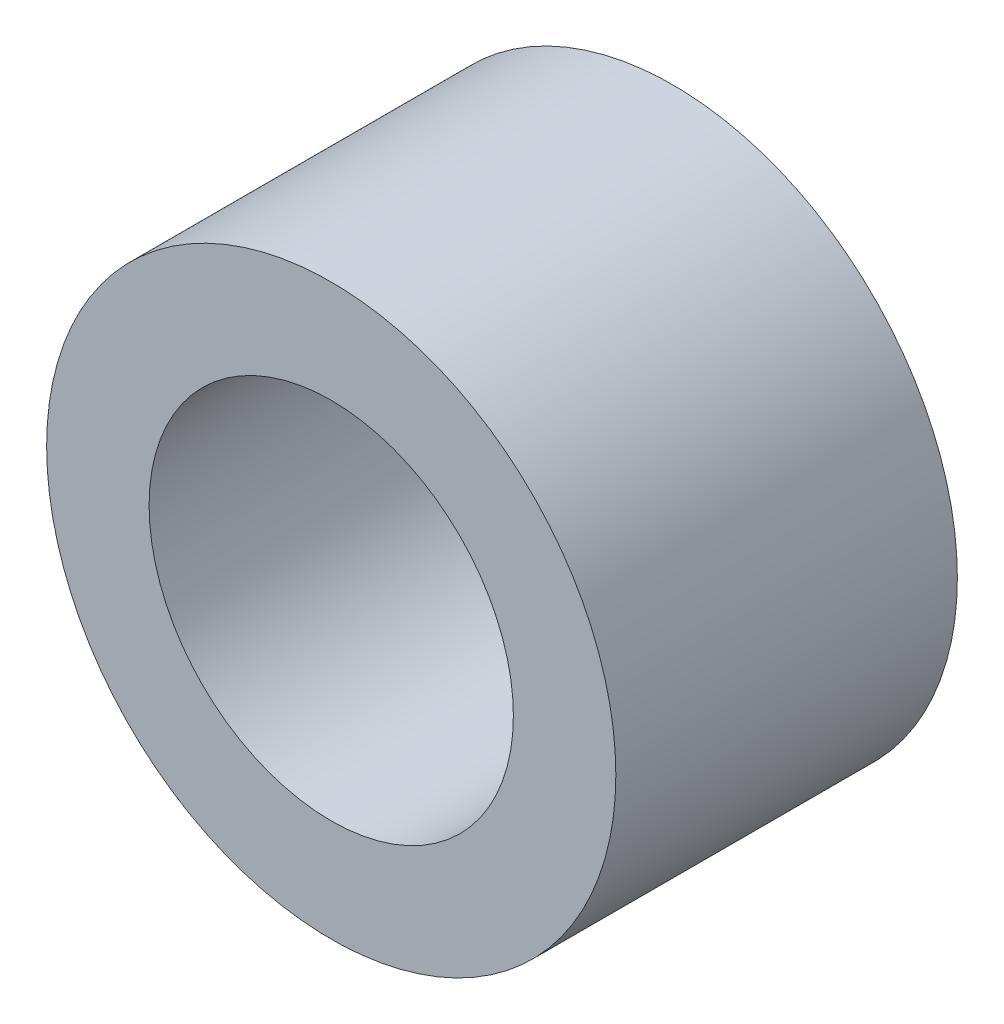
ISO-10303-21;
HEADER;
FILE_DESCRIPTION(('STEP AP214'),'2;1');
FILE_NAME('part.step','',(''),(''),'','','');
FILE_SCHEMA(('AUTOMOTIVE_DESIGN { 1 0 10303 214 1 1 1 1 }'));
ENDSEC;
DATA;
#1=APPLICATION_CONTEXT('core data for automotive mechanical design processes');
#2=APPLICATION_PROTOCOL_DEFINITION('international standard','automotive_design',2000,#1);
#3=PRODUCT_CONTEXT('',#1,'mechanical');
#4=PRODUCT('Part','Part','',(#3));
#5=PRODUCT_RELATED_PRODUCT_CATEGORY('part','',(#4));
#6=PRODUCT_DEFINITION_FORMATION('','',#4);
#7=PRODUCT_DEFINITION_CONTEXT('part definition',#1,'design');
#8=PRODUCT_DEFINITION('design','',#6,#7);
#9=PRODUCT_DEFINITION_SHAPE('','',#8);
#10=(LENGTH_UNIT() NAMED_UNIT(*) SI_UNIT(.MILLI.,.METRE.));
#11=(NAMED_UNIT(*) PLANE_ANGLE_UNIT() SI_UNIT($,.RADIAN.));
#12=(NAMED_UNIT(*) SI_UNIT($,.STERADIAN.) SOLID_ANGLE_UNIT());
#13=UNCERTAINTY_MEASURE_WITH_UNIT(LENGTH_MEASURE(1.E-05),#10,'distance_accuracy_value','');
#14=(GEOMETRIC_REPRESENTATION_CONTEXT(3) GLOBAL_UNCERTAINTY_ASSIGNED_CONTEXT((#13)) GLOBAL_UNIT_ASSIGNED_CONTEXT((#10,
#11,#12)) REPRESENTATION_CONTEXT('',''));
#15=CARTESIAN_POINT('',(0.,0.,0.));
#16=DIRECTION('',(0.,0.,1.));
#17=DIRECTION('',(1.,0.,0.));
#18=AXIS2_PLACEMENT_3D('',#15,#16,#17);
#19=CARTESIAN_POINT('',(0.,0.,3.));
#20=DIRECTION('',(0.,0.,1.));
#21=DIRECTION('',(1.,0.,0.));
#22=AXIS2_PLACEMENT_3D('',#19,#20,#21);
#23=PLANE('',#22);
#24=CARTESIAN_POINT('',(0.,0.,3.));
#25=DIRECTION('',(0.,0.,1.));
#26=DIRECTION('',(1.,0.,0.));
#27=AXIS2_PLACEMENT_3D('',#24,#25,#26);
#28=CIRCLE('',#27,2.5);
#29=CARTESIAN_POINT('',(2.5,0.,3.));
#30=VERTEX_POINT('',#29);
#31=EDGE_CURVE('E10',#30,#30,#28,.T.);
#32=ORIENTED_EDGE('',*,*,#31,.T.);
#33=EDGE_LOOP('',(#32));
#34=FACE_BOUND('',#33,.T.);
#35=CARTESIAN_POINT('',(0.,0.,3.));
#36=DIRECTION('',(0.,0.,1.));
#37=DIRECTION('',(1.,0.,0.));
#38=AXIS2_PLACEMENT_3D('',#35,#36,#37);
#39=CIRCLE('',#38,1.6);
#40=CARTESIAN_POINT('',(1.6,0.,3.));
#41=VERTEX_POINT('',#40);
#42=EDGE_CURVE('E46',#41,#41,#39,.T.);
#43=ORIENTED_EDGE('',*,*,#42,.F.);
#44=EDGE_LOOP('',(#43));
#45=FACE_BOUND('',#44,.T.);
#46=ADVANCED_FACE('F35',(#34,#45),#23,.T.);
#47=CARTESIAN_POINT('',(0.,0.,0.));
#48=DIRECTION('',(0.,0.,1.));
#49=DIRECTION('',(1.,0.,0.));
#50=AXIS2_PLACEMENT_3D('',#47,#48,#49);
#51=PLANE('',#50);
#52=CARTESIAN_POINT('',(0.,0.,0.));
#53=DIRECTION('',(0.,0.,1.));
#54=DIRECTION('',(1.,0.,0.));
#55=AXIS2_PLACEMENT_3D('',#52,#53,#54);
#56=CIRCLE('',#55,2.5);
#57=CARTESIAN_POINT('',(2.5,0.,0.));
#58=VERTEX_POINT('',#57);
#59=EDGE_CURVE('E39',#58,#58,#56,.T.);
#60=ORIENTED_EDGE('',*,*,#59,.F.);
#61=EDGE_LOOP('',(#60));
#62=FACE_BOUND('',#61,.T.);
#63=CARTESIAN_POINT('',(0.,0.,0.));
#64=DIRECTION('',(0.,0.,1.));
#65=DIRECTION('',(1.,0.,0.));
#66=AXIS2_PLACEMENT_3D('',#63,#64,#65);
#67=CIRCLE('',#66,1.6);
#68=CARTESIAN_POINT('',(1.6,0.,0.));
#69=VERTEX_POINT('',#68);
#70=EDGE_CURVE('E48',#69,#69,#67,.T.);
#71=ORIENTED_EDGE('',*,*,#70,.T.);
#72=EDGE_LOOP('',(#71));
#73=FACE_BOUND('',#72,.T.);
#74=ADVANCED_FACE('F58',(#62,#73),#51,.F.);
#75=CARTESIAN_POINT('',(0.,0.,3.));
#76=DIRECTION('',(0.,0.,-1.));
#77=DIRECTION('',(-1.,0.,0.));
#78=AXIS2_PLACEMENT_3D('',#75,#76,#77);
#79=CYLINDRICAL_SURFACE('',#78,2.5);
#80=ORIENTED_EDGE('',*,*,#31,.F.);
#81=EDGE_LOOP('',(#80));
#82=FACE_BOUND('',#81,.T.);
#83=ORIENTED_EDGE('',*,*,#59,.T.);
#84=EDGE_LOOP('',(#83));
#85=FACE_BOUND('',#84,.T.);
#86=ADVANCED_FACE('F37',(#82,#85),#79,.T.);
#87=CARTESIAN_POINT('',(0.,0.,3.));
#88=DIRECTION('',(0.,0.,-1.));
#89=DIRECTION('',(-1.,0.,0.));
#90=AXIS2_PLACEMENT_3D('',#87,#88,#89);
#91=CYLINDRICAL_SURFACE('',#90,1.6);
#92=ORIENTED_EDGE('',*,*,#42,.T.);
#93=EDGE_LOOP('',(#92));
#94=FACE_BOUND('',#93,.T.);
#95=ORIENTED_EDGE('',*,*,#70,.F.);
#96=EDGE_LOOP('',(#95));
#97=FACE_BOUND('',#96,.T.);
#98=ADVANCED_FACE('F54',(#94,#97),#91,.F.);
#99=CLOSED_SHELL('',(#46,#74,#86,#98));
#100=MANIFOLD_SOLID_BREP('B2',#99);
#101=ADVANCED_BREP_SHAPE_REPRESENTATION('',(#18,#100),#14);
#102=SHAPE_DEFINITION_REPRESENTATION(#9,#101);
ENDSEC;
END-ISO-10303-21;
